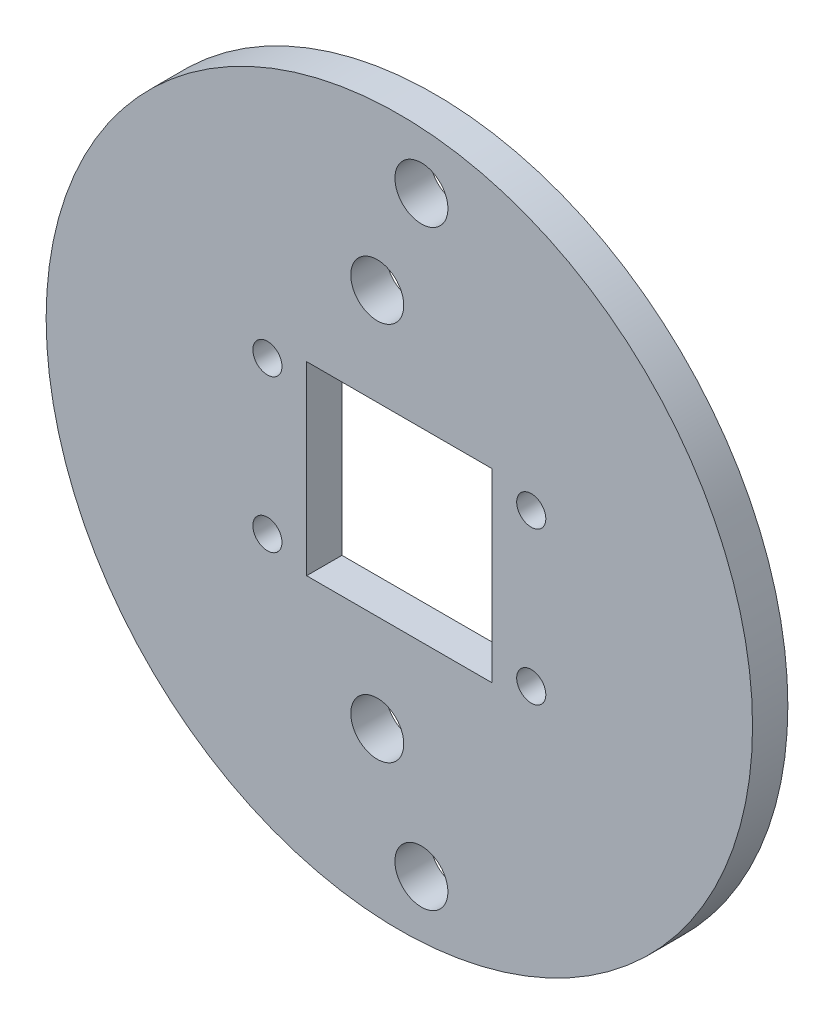
ISO-10303-21;
HEADER;
FILE_DESCRIPTION(('STEP AP214'),'2;1');
FILE_NAME('part.step','',(''),(''),'','','');
FILE_SCHEMA(('AUTOMOTIVE_DESIGN { 1 0 10303 214 1 1 1 1 }'));
ENDSEC;
DATA;
#1=APPLICATION_CONTEXT('core data for automotive mechanical design processes');
#2=APPLICATION_PROTOCOL_DEFINITION('international standard','automotive_design',2000,#1);
#3=PRODUCT_CONTEXT('',#1,'mechanical');
#4=PRODUCT('Part','Part','',(#3));
#5=PRODUCT_RELATED_PRODUCT_CATEGORY('part','',(#4));
#6=PRODUCT_DEFINITION_FORMATION('','',#4);
#7=PRODUCT_DEFINITION_CONTEXT('part definition',#1,'design');
#8=PRODUCT_DEFINITION('design','',#6,#7);
#9=PRODUCT_DEFINITION_SHAPE('','',#8);
#10=(LENGTH_UNIT() NAMED_UNIT(*) SI_UNIT(.MILLI.,.METRE.));
#11=(NAMED_UNIT(*) PLANE_ANGLE_UNIT() SI_UNIT($,.RADIAN.));
#12=(NAMED_UNIT(*) SI_UNIT($,.STERADIAN.) SOLID_ANGLE_UNIT());
#13=UNCERTAINTY_MEASURE_WITH_UNIT(LENGTH_MEASURE(1.E-05),#10,'distance_accuracy_value','');
#14=(GEOMETRIC_REPRESENTATION_CONTEXT(3) GLOBAL_UNCERTAINTY_ASSIGNED_CONTEXT((#13)) GLOBAL_UNIT_ASSIGNED_CONTEXT((#10,
#11,#12)) REPRESENTATION_CONTEXT('',''));
#15=CARTESIAN_POINT('',(0.,0.,0.));
#16=DIRECTION('',(0.,0.,1.));
#17=DIRECTION('',(1.,0.,0.));
#18=AXIS2_PLACEMENT_3D('',#15,#16,#17);
#19=CARTESIAN_POINT('',(0.,0.,4.));
#20=DIRECTION('',(0.,0.,1.));
#21=DIRECTION('',(1.,0.,0.));
#22=AXIS2_PLACEMENT_3D('',#19,#20,#21);
#23=PLANE('',#22);
#24=CARTESIAN_POINT('',(-2.5,-21.5,4.));
#25=DIRECTION('',(0.,0.,1.));
#26=DIRECTION('',(-1.,0.,0.));
#27=AXIS2_PLACEMENT_3D('',#24,#25,#26);
#28=CIRCLE('',#27,3.);
#29=CARTESIAN_POINT('',(-5.5,-21.5,4.));
#30=VERTEX_POINT('',#29);
#31=EDGE_CURVE('E149',#30,#30,#28,.T.);
#32=ORIENTED_EDGE('',*,*,#31,.F.);
#33=EDGE_LOOP('',(#32));
#34=FACE_BOUND('',#33,.T.);
#35=CARTESIAN_POINT('',(-14.9389382152815,8.62500000000018,4.));
#36=DIRECTION('',(0.,0.,1.));
#37=DIRECTION('',(1.,0.,0.));
#38=AXIS2_PLACEMENT_3D('',#35,#36,#37);
#39=CIRCLE('',#38,1.65);
#40=CARTESIAN_POINT('',(-13.2889382152815,8.62500000000018,4.));
#41=VERTEX_POINT('',#40);
#42=EDGE_CURVE('E153',#41,#41,#39,.T.);
#43=ORIENTED_EDGE('',*,*,#42,.F.);
#44=EDGE_LOOP('',(#43));
#45=FACE_BOUND('',#44,.T.);
#46=CARTESIAN_POINT('',(14.9389382152815,-8.62500000000007,4.));
#47=DIRECTION('',(0.,0.,1.));
#48=DIRECTION('',(1.,0.,0.));
#49=AXIS2_PLACEMENT_3D('',#46,#47,#48);
#50=CIRCLE('',#49,1.65);
#51=CARTESIAN_POINT('',(16.5889382152815,-8.62500000000007,4.));
#52=VERTEX_POINT('',#51);
#53=EDGE_CURVE('E156',#52,#52,#50,.T.);
#54=ORIENTED_EDGE('',*,*,#53,.F.);
#55=EDGE_LOOP('',(#54));
#56=FACE_BOUND('',#55,.T.);
#57=DIRECTION('',(-1.,0.,0.));
#58=VECTOR('',#57,1.);
#59=CARTESIAN_POINT('',(-10.5,10.5,4.));
#60=LINE('',#59,#58);
#61=CARTESIAN_POINT('',(10.5,10.5,4.));
#62=VERTEX_POINT('',#61);
#63=CARTESIAN_POINT('',(-10.5,10.5,4.));
#64=VERTEX_POINT('',#63);
#65=EDGE_CURVE('E90',#62,#64,#60,.T.);
#66=ORIENTED_EDGE('',*,*,#65,.F.);
#67=DIRECTION('',(0.,1.,0.));
#68=VECTOR('',#67,1.);
#69=CARTESIAN_POINT('',(10.5,10.5,4.));
#70=LINE('',#69,#68);
#71=CARTESIAN_POINT('',(10.5,-10.5,4.));
#72=VERTEX_POINT('',#71);
#73=EDGE_CURVE('E82',#72,#62,#70,.T.);
#74=ORIENTED_EDGE('',*,*,#73,.F.);
#75=DIRECTION('',(1.,0.,0.));
#76=VECTOR('',#75,1.);
#77=CARTESIAN_POINT('',(-10.5,-10.5,4.));
#78=LINE('',#77,#76);
#79=CARTESIAN_POINT('',(-10.5,-10.5,4.));
#80=VERTEX_POINT('',#79);
#81=EDGE_CURVE('E105',#80,#72,#78,.T.);
#82=ORIENTED_EDGE('',*,*,#81,.F.);
#83=DIRECTION('',(0.,-1.,0.));
#84=VECTOR('',#83,1.);
#85=CARTESIAN_POINT('',(-10.5,10.5,4.));
#86=LINE('',#85,#84);
#87=EDGE_CURVE('E103',#64,#80,#86,.T.);
#88=ORIENTED_EDGE('',*,*,#87,.F.);
#89=EDGE_LOOP('',(#66,#74,#82,#88));
#90=FACE_BOUND('',#89,.T.);
#91=CARTESIAN_POINT('',(-2.5,21.5,4.));
#92=DIRECTION('',(0.,0.,1.));
#93=DIRECTION('',(1.,0.,0.));
#94=AXIS2_PLACEMENT_3D('',#91,#92,#93);
#95=CIRCLE('',#94,3.);
#96=CARTESIAN_POINT('',(0.5,21.5,4.));
#97=VERTEX_POINT('',#96);
#98=EDGE_CURVE('E121',#97,#97,#95,.T.);
#99=ORIENTED_EDGE('',*,*,#98,.F.);
#100=EDGE_LOOP('',(#99));
#101=FACE_BOUND('',#100,.T.);
#102=CARTESIAN_POINT('',(0.,0.,4.));
#103=DIRECTION('',(0.,0.,1.));
#104=DIRECTION('',(1.,0.,0.));
#105=AXIS2_PLACEMENT_3D('',#102,#103,#104);
#106=CIRCLE('',#105,40.);
#107=CARTESIAN_POINT('',(40.,0.,4.));
#108=VERTEX_POINT('',#107);
#109=EDGE_CURVE('E11',#108,#108,#106,.T.);
#110=ORIENTED_EDGE('',*,*,#109,.T.);
#111=EDGE_LOOP('',(#110));
#112=FACE_BOUND('',#111,.T.);
#113=CARTESIAN_POINT('',(14.9389382152816,8.62499999999997,4.));
#114=DIRECTION('',(0.,0.,1.));
#115=DIRECTION('',(1.,0.,0.));
#116=AXIS2_PLACEMENT_3D('',#113,#114,#115);
#117=CIRCLE('',#116,1.65);
#118=CARTESIAN_POINT('',(16.5889382152816,8.62499999999997,4.));
#119=VERTEX_POINT('',#118);
#120=EDGE_CURVE('E111',#119,#119,#117,.T.);
#121=ORIENTED_EDGE('',*,*,#120,.F.);
#122=EDGE_LOOP('',(#121));
#123=FACE_BOUND('',#122,.T.);
#124=CARTESIAN_POINT('',(-14.9389382152816,-8.62499999999986,4.));
#125=DIRECTION('',(0.,0.,1.));
#126=DIRECTION('',(1.,0.,0.));
#127=AXIS2_PLACEMENT_3D('',#124,#125,#126);
#128=CIRCLE('',#127,1.65);
#129=CARTESIAN_POINT('',(-13.2889382152816,-8.62499999999986,4.));
#130=VERTEX_POINT('',#129);
#131=EDGE_CURVE('E163',#130,#130,#128,.T.);
#132=ORIENTED_EDGE('',*,*,#131,.F.);
#133=EDGE_LOOP('',(#132));
#134=FACE_BOUND('',#133,.T.);
#135=CARTESIAN_POINT('',(2.5,33.5,4.));
#136=DIRECTION('',(0.,0.,1.));
#137=DIRECTION('',(1.,0.,0.));
#138=AXIS2_PLACEMENT_3D('',#135,#136,#137);
#139=CIRCLE('',#138,3.);
#140=CARTESIAN_POINT('',(5.5,33.5,4.));
#141=VERTEX_POINT('',#140);
#142=EDGE_CURVE('E182',#141,#141,#139,.T.);
#143=ORIENTED_EDGE('',*,*,#142,.F.);
#144=EDGE_LOOP('',(#143));
#145=FACE_BOUND('',#144,.T.);
#146=CARTESIAN_POINT('',(2.5,-33.5,4.));
#147=DIRECTION('',(0.,0.,1.));
#148=DIRECTION('',(-1.,0.,0.));
#149=AXIS2_PLACEMENT_3D('',#146,#147,#148);
#150=CIRCLE('',#149,3.);
#151=CARTESIAN_POINT('',(-0.500000000000004,-33.5,4.));
#152=VERTEX_POINT('',#151);
#153=EDGE_CURVE('E185',#152,#152,#150,.T.);
#154=ORIENTED_EDGE('',*,*,#153,.F.);
#155=EDGE_LOOP('',(#154));
#156=FACE_BOUND('',#155,.T.);
#157=ADVANCED_FACE('F41',(#34,#45,#56,#90,#101,#112,#123,#134,#145,#156),#23,.T.);
#158=CARTESIAN_POINT('',(0.,0.,0.));
#159=DIRECTION('',(0.,0.,1.));
#160=DIRECTION('',(1.,0.,0.));
#161=AXIS2_PLACEMENT_3D('',#158,#159,#160);
#162=PLANE('',#161);
#163=CARTESIAN_POINT('',(-2.5,21.5,0.));
#164=DIRECTION('',(0.,0.,1.));
#165=DIRECTION('',(1.,0.,0.));
#166=AXIS2_PLACEMENT_3D('',#163,#164,#165);
#167=CIRCLE('',#166,3.);
#168=CARTESIAN_POINT('',(0.5,21.5,0.));
#169=VERTEX_POINT('',#168);
#170=EDGE_CURVE('E98',#169,#169,#167,.T.);
#171=ORIENTED_EDGE('',*,*,#170,.T.);
#172=EDGE_LOOP('',(#171));
#173=FACE_BOUND('',#172,.T.);
#174=CARTESIAN_POINT('',(0.,0.,0.));
#175=DIRECTION('',(0.,0.,1.));
#176=DIRECTION('',(1.,0.,0.));
#177=AXIS2_PLACEMENT_3D('',#174,#175,#176);
#178=CIRCLE('',#177,40.);
#179=CARTESIAN_POINT('',(40.,0.,0.));
#180=VERTEX_POINT('',#179);
#181=EDGE_CURVE('E45',#180,#180,#178,.T.);
#182=ORIENTED_EDGE('',*,*,#181,.F.);
#183=EDGE_LOOP('',(#182));
#184=FACE_BOUND('',#183,.T.);
#185=DIRECTION('',(0.,1.,0.));
#186=VECTOR('',#185,1.);
#187=CARTESIAN_POINT('',(10.5,10.5,0.));
#188=LINE('',#187,#186);
#189=CARTESIAN_POINT('',(10.5,-10.5,0.));
#190=VERTEX_POINT('',#189);
#191=CARTESIAN_POINT('',(10.5,10.5,0.));
#192=VERTEX_POINT('',#191);
#193=EDGE_CURVE('E64',#190,#192,#188,.T.);
#194=ORIENTED_EDGE('',*,*,#193,.T.);
#195=DIRECTION('',(-1.,0.,0.));
#196=VECTOR('',#195,1.);
#197=CARTESIAN_POINT('',(-10.5,10.5,0.));
#198=LINE('',#197,#196);
#199=CARTESIAN_POINT('',(-10.5,10.5,0.));
#200=VERTEX_POINT('',#199);
#201=EDGE_CURVE('E97',#192,#200,#198,.T.);
#202=ORIENTED_EDGE('',*,*,#201,.T.);
#203=DIRECTION('',(0.,-1.,0.));
#204=VECTOR('',#203,1.);
#205=CARTESIAN_POINT('',(-10.5,10.5,0.));
#206=LINE('',#205,#204);
#207=CARTESIAN_POINT('',(-10.5,-10.5,0.));
#208=VERTEX_POINT('',#207);
#209=EDGE_CURVE('E113',#200,#208,#206,.T.);
#210=ORIENTED_EDGE('',*,*,#209,.T.);
#211=DIRECTION('',(1.,0.,0.));
#212=VECTOR('',#211,1.);
#213=CARTESIAN_POINT('',(-10.5,-10.5,0.));
#214=LINE('',#213,#212);
#215=EDGE_CURVE('E91',#208,#190,#214,.T.);
#216=ORIENTED_EDGE('',*,*,#215,.T.);
#217=EDGE_LOOP('',(#194,#202,#210,#216));
#218=FACE_BOUND('',#217,.T.);
#219=CARTESIAN_POINT('',(14.9389382152816,8.62499999999997,0.));
#220=DIRECTION('',(0.,0.,1.));
#221=DIRECTION('',(1.,0.,0.));
#222=AXIS2_PLACEMENT_3D('',#219,#220,#221);
#223=CIRCLE('',#222,1.65);
#224=CARTESIAN_POINT('',(16.5889382152816,8.62499999999997,0.));
#225=VERTEX_POINT('',#224);
#226=EDGE_CURVE('E158',#225,#225,#223,.T.);
#227=ORIENTED_EDGE('',*,*,#226,.T.);
#228=EDGE_LOOP('',(#227));
#229=FACE_BOUND('',#228,.T.);
#230=CARTESIAN_POINT('',(14.9389382152815,-8.62500000000007,0.));
#231=DIRECTION('',(0.,0.,1.));
#232=DIRECTION('',(1.,0.,0.));
#233=AXIS2_PLACEMENT_3D('',#230,#231,#232);
#234=CIRCLE('',#233,1.65);
#235=CARTESIAN_POINT('',(16.5889382152815,-8.62500000000007,0.));
#236=VERTEX_POINT('',#235);
#237=EDGE_CURVE('E159',#236,#236,#234,.T.);
#238=ORIENTED_EDGE('',*,*,#237,.T.);
#239=EDGE_LOOP('',(#238));
#240=FACE_BOUND('',#239,.T.);
#241=CARTESIAN_POINT('',(-14.9389382152816,-8.62499999999986,0.));
#242=DIRECTION('',(0.,0.,1.));
#243=DIRECTION('',(1.,0.,0.));
#244=AXIS2_PLACEMENT_3D('',#241,#242,#243);
#245=CIRCLE('',#244,1.65);
#246=CARTESIAN_POINT('',(-13.2889382152816,-8.62499999999986,0.));
#247=VERTEX_POINT('',#246);
#248=EDGE_CURVE('E166',#247,#247,#245,.T.);
#249=ORIENTED_EDGE('',*,*,#248,.T.);
#250=EDGE_LOOP('',(#249));
#251=FACE_BOUND('',#250,.T.);
#252=CARTESIAN_POINT('',(-14.9389382152815,8.62500000000018,0.));
#253=DIRECTION('',(0.,0.,1.));
#254=DIRECTION('',(1.,0.,0.));
#255=AXIS2_PLACEMENT_3D('',#252,#253,#254);
#256=CIRCLE('',#255,1.65);
#257=CARTESIAN_POINT('',(-13.2889382152815,8.62500000000018,0.));
#258=VERTEX_POINT('',#257);
#259=EDGE_CURVE('E198',#258,#258,#256,.T.);
#260=ORIENTED_EDGE('',*,*,#259,.T.);
#261=EDGE_LOOP('',(#260));
#262=FACE_BOUND('',#261,.T.);
#263=CARTESIAN_POINT('',(2.5,33.5,0.));
#264=DIRECTION('',(0.,0.,1.));
#265=DIRECTION('',(1.,0.,0.));
#266=AXIS2_PLACEMENT_3D('',#263,#264,#265);
#267=CIRCLE('',#266,3.);
#268=CARTESIAN_POINT('',(5.5,33.5,0.));
#269=VERTEX_POINT('',#268);
#270=EDGE_CURVE('E195',#269,#269,#267,.T.);
#271=ORIENTED_EDGE('',*,*,#270,.T.);
#272=EDGE_LOOP('',(#271));
#273=FACE_BOUND('',#272,.T.);
#274=CARTESIAN_POINT('',(-2.5,-21.5,0.));
#275=DIRECTION('',(0.,0.,1.));
#276=DIRECTION('',(-1.,0.,0.));
#277=AXIS2_PLACEMENT_3D('',#274,#275,#276);
#278=CIRCLE('',#277,3.);
#279=CARTESIAN_POINT('',(-5.5,-21.5,0.));
#280=VERTEX_POINT('',#279);
#281=EDGE_CURVE('E187',#280,#280,#278,.T.);
#282=ORIENTED_EDGE('',*,*,#281,.T.);
#283=EDGE_LOOP('',(#282));
#284=FACE_BOUND('',#283,.T.);
#285=CARTESIAN_POINT('',(2.5,-33.5,0.));
#286=DIRECTION('',(0.,0.,1.));
#287=DIRECTION('',(-1.,0.,0.));
#288=AXIS2_PLACEMENT_3D('',#285,#286,#287);
#289=CIRCLE('',#288,3.);
#290=CARTESIAN_POINT('',(-0.500000000000004,-33.5,0.));
#291=VERTEX_POINT('',#290);
#292=EDGE_CURVE('E188',#291,#291,#289,.T.);
#293=ORIENTED_EDGE('',*,*,#292,.T.);
#294=EDGE_LOOP('',(#293));
#295=FACE_BOUND('',#294,.T.);
#296=ADVANCED_FACE('F127',(#173,#184,#218,#229,#240,#251,#262,#273,#284,#295),#162,.F.);
#297=CARTESIAN_POINT('',(0.,0.,4.));
#298=DIRECTION('',(0.,0.,-1.));
#299=DIRECTION('',(-1.,0.,0.));
#300=AXIS2_PLACEMENT_3D('',#297,#298,#299);
#301=CYLINDRICAL_SURFACE('',#300,40.);
#302=ORIENTED_EDGE('',*,*,#109,.F.);
#303=EDGE_LOOP('',(#302));
#304=FACE_BOUND('',#303,.T.);
#305=ORIENTED_EDGE('',*,*,#181,.T.);
#306=EDGE_LOOP('',(#305));
#307=FACE_BOUND('',#306,.T.);
#308=ADVANCED_FACE('F43',(#304,#307),#301,.T.);
#309=CARTESIAN_POINT('',(-2.5,21.5,4.));
#310=DIRECTION('',(0.,0.,-1.));
#311=DIRECTION('',(-1.,0.,0.));
#312=AXIS2_PLACEMENT_3D('',#309,#310,#311);
#313=CYLINDRICAL_SURFACE('',#312,3.);
#314=ORIENTED_EDGE('',*,*,#98,.T.);
#315=EDGE_LOOP('',(#314));
#316=FACE_BOUND('',#315,.T.);
#317=ORIENTED_EDGE('',*,*,#170,.F.);
#318=EDGE_LOOP('',(#317));
#319=FACE_BOUND('',#318,.T.);
#320=ADVANCED_FACE('F130',(#316,#319),#313,.F.);
#321=CARTESIAN_POINT('',(10.5,10.5,4.));
#322=DIRECTION('',(-1.,0.,0.));
#323=DIRECTION('',(0.,-1.,0.));
#324=AXIS2_PLACEMENT_3D('',#321,#322,#323);
#325=PLANE('',#324);
#326=ORIENTED_EDGE('',*,*,#193,.F.);
#327=DIRECTION('',(0.,0.,-1.));
#328=VECTOR('',#327,1.);
#329=CARTESIAN_POINT('',(10.5,-10.5,4.));
#330=LINE('',#329,#328);
#331=EDGE_CURVE('E86',#72,#190,#330,.T.);
#332=ORIENTED_EDGE('',*,*,#331,.F.);
#333=ORIENTED_EDGE('',*,*,#73,.T.);
#334=DIRECTION('',(0.,0.,-1.));
#335=VECTOR('',#334,1.);
#336=CARTESIAN_POINT('',(10.5,10.5,4.));
#337=LINE('',#336,#335);
#338=EDGE_CURVE('E85',#62,#192,#337,.T.);
#339=ORIENTED_EDGE('',*,*,#338,.T.);
#340=EDGE_LOOP('',(#326,#332,#333,#339));
#341=FACE_BOUND('',#340,.T.);
#342=ADVANCED_FACE('F84',(#341),#325,.T.);
#343=CARTESIAN_POINT('',(-10.5,10.5,4.));
#344=DIRECTION('',(0.,-1.,0.));
#345=DIRECTION('',(0.,0.,-1.));
#346=AXIS2_PLACEMENT_3D('',#343,#344,#345);
#347=PLANE('',#346);
#348=ORIENTED_EDGE('',*,*,#201,.F.);
#349=ORIENTED_EDGE('',*,*,#338,.F.);
#350=ORIENTED_EDGE('',*,*,#65,.T.);
#351=DIRECTION('',(0.,0.,-1.));
#352=VECTOR('',#351,1.);
#353=CARTESIAN_POINT('',(-10.5,10.5,4.));
#354=LINE('',#353,#352);
#355=EDGE_CURVE('E99',#64,#200,#354,.T.);
#356=ORIENTED_EDGE('',*,*,#355,.T.);
#357=EDGE_LOOP('',(#348,#349,#350,#356));
#358=FACE_BOUND('',#357,.T.);
#359=ADVANCED_FACE('F94',(#358),#347,.T.);
#360=CARTESIAN_POINT('',(-10.5,10.5,4.));
#361=DIRECTION('',(1.,0.,0.));
#362=DIRECTION('',(0.,1.,0.));
#363=AXIS2_PLACEMENT_3D('',#360,#361,#362);
#364=PLANE('',#363);
#365=ORIENTED_EDGE('',*,*,#209,.F.);
#366=ORIENTED_EDGE('',*,*,#355,.F.);
#367=ORIENTED_EDGE('',*,*,#87,.T.);
#368=DIRECTION('',(0.,0.,-1.));
#369=VECTOR('',#368,1.);
#370=CARTESIAN_POINT('',(-10.5,-10.5,4.));
#371=LINE('',#370,#369);
#372=EDGE_CURVE('E56',#80,#208,#371,.T.);
#373=ORIENTED_EDGE('',*,*,#372,.T.);
#374=EDGE_LOOP('',(#365,#366,#367,#373));
#375=FACE_BOUND('',#374,.T.);
#376=ADVANCED_FACE('F229',(#375),#364,.T.);
#377=CARTESIAN_POINT('',(-10.5,-10.5,4.));
#378=DIRECTION('',(0.,1.,0.));
#379=DIRECTION('',(0.,0.,1.));
#380=AXIS2_PLACEMENT_3D('',#377,#378,#379);
#381=PLANE('',#380);
#382=ORIENTED_EDGE('',*,*,#215,.F.);
#383=ORIENTED_EDGE('',*,*,#372,.F.);
#384=ORIENTED_EDGE('',*,*,#81,.T.);
#385=ORIENTED_EDGE('',*,*,#331,.T.);
#386=EDGE_LOOP('',(#382,#383,#384,#385));
#387=FACE_BOUND('',#386,.T.);
#388=ADVANCED_FACE('F226',(#387),#381,.T.);
#389=CARTESIAN_POINT('',(14.9389382152816,8.62499999999997,4.));
#390=DIRECTION('',(0.,0.,-1.));
#391=DIRECTION('',(-1.,0.,0.));
#392=AXIS2_PLACEMENT_3D('',#389,#390,#391);
#393=CYLINDRICAL_SURFACE('',#392,1.65);
#394=ORIENTED_EDGE('',*,*,#120,.T.);
#395=EDGE_LOOP('',(#394));
#396=FACE_BOUND('',#395,.T.);
#397=ORIENTED_EDGE('',*,*,#226,.F.);
#398=EDGE_LOOP('',(#397));
#399=FACE_BOUND('',#398,.T.);
#400=ADVANCED_FACE('F172',(#396,#399),#393,.F.);
#401=CARTESIAN_POINT('',(14.9389382152815,-8.62500000000007,4.));
#402=DIRECTION('',(0.,0.,-1.));
#403=DIRECTION('',(-1.,0.,0.));
#404=AXIS2_PLACEMENT_3D('',#401,#402,#403);
#405=CYLINDRICAL_SURFACE('',#404,1.65);
#406=ORIENTED_EDGE('',*,*,#53,.T.);
#407=EDGE_LOOP('',(#406));
#408=FACE_BOUND('',#407,.T.);
#409=ORIENTED_EDGE('',*,*,#237,.F.);
#410=EDGE_LOOP('',(#409));
#411=FACE_BOUND('',#410,.T.);
#412=ADVANCED_FACE('F212',(#408,#411),#405,.F.);
#413=CARTESIAN_POINT('',(-14.9389382152816,-8.62499999999986,4.));
#414=DIRECTION('',(0.,0.,-1.));
#415=DIRECTION('',(-1.,0.,0.));
#416=AXIS2_PLACEMENT_3D('',#413,#414,#415);
#417=CYLINDRICAL_SURFACE('',#416,1.65);
#418=ORIENTED_EDGE('',*,*,#131,.T.);
#419=EDGE_LOOP('',(#418));
#420=FACE_BOUND('',#419,.T.);
#421=ORIENTED_EDGE('',*,*,#248,.F.);
#422=EDGE_LOOP('',(#421));
#423=FACE_BOUND('',#422,.T.);
#424=ADVANCED_FACE('F209',(#420,#423),#417,.F.);
#425=CARTESIAN_POINT('',(-14.9389382152815,8.62500000000018,4.));
#426=DIRECTION('',(0.,0.,-1.));
#427=DIRECTION('',(-1.,0.,0.));
#428=AXIS2_PLACEMENT_3D('',#425,#426,#427);
#429=CYLINDRICAL_SURFACE('',#428,1.65);
#430=ORIENTED_EDGE('',*,*,#42,.T.);
#431=EDGE_LOOP('',(#430));
#432=FACE_BOUND('',#431,.T.);
#433=ORIENTED_EDGE('',*,*,#259,.F.);
#434=EDGE_LOOP('',(#433));
#435=FACE_BOUND('',#434,.T.);
#436=ADVANCED_FACE('F211',(#432,#435),#429,.F.);
#437=CARTESIAN_POINT('',(2.5,33.5,4.));
#438=DIRECTION('',(0.,0.,-1.));
#439=DIRECTION('',(-1.,0.,0.));
#440=AXIS2_PLACEMENT_3D('',#437,#438,#439);
#441=CYLINDRICAL_SURFACE('',#440,3.);
#442=ORIENTED_EDGE('',*,*,#142,.T.);
#443=EDGE_LOOP('',(#442));
#444=FACE_BOUND('',#443,.T.);
#445=ORIENTED_EDGE('',*,*,#270,.F.);
#446=EDGE_LOOP('',(#445));
#447=FACE_BOUND('',#446,.T.);
#448=ADVANCED_FACE('F218',(#444,#447),#441,.F.);
#449=CARTESIAN_POINT('',(-2.5,-21.5,4.));
#450=DIRECTION('',(0.,0.,-1.));
#451=DIRECTION('',(-1.,0.,0.));
#452=AXIS2_PLACEMENT_3D('',#449,#450,#451);
#453=CYLINDRICAL_SURFACE('',#452,3.);
#454=ORIENTED_EDGE('',*,*,#31,.T.);
#455=EDGE_LOOP('',(#454));
#456=FACE_BOUND('',#455,.T.);
#457=ORIENTED_EDGE('',*,*,#281,.F.);
#458=EDGE_LOOP('',(#457));
#459=FACE_BOUND('',#458,.T.);
#460=ADVANCED_FACE('F278',(#456,#459),#453,.F.);
#461=CARTESIAN_POINT('',(2.5,-33.5,4.));
#462=DIRECTION('',(0.,0.,-1.));
#463=DIRECTION('',(-1.,0.,0.));
#464=AXIS2_PLACEMENT_3D('',#461,#462,#463);
#465=CYLINDRICAL_SURFACE('',#464,3.);
#466=ORIENTED_EDGE('',*,*,#153,.T.);
#467=EDGE_LOOP('',(#466));
#468=FACE_BOUND('',#467,.T.);
#469=ORIENTED_EDGE('',*,*,#292,.F.);
#470=EDGE_LOOP('',(#469));
#471=FACE_BOUND('',#470,.T.);
#472=ADVANCED_FACE('F287',(#468,#471),#465,.F.);
#473=CLOSED_SHELL('',(#157,#296,#308,#320,#342,#359,#376,#388,#400,#412,#424,#436,#448,#460,#472));
#474=MANIFOLD_SOLID_BREP('B2',#473);
#475=ADVANCED_BREP_SHAPE_REPRESENTATION('',(#18,#474),#14);
#476=SHAPE_DEFINITION_REPRESENTATION(#9,#475);
ENDSEC;
END-ISO-10303-21;
